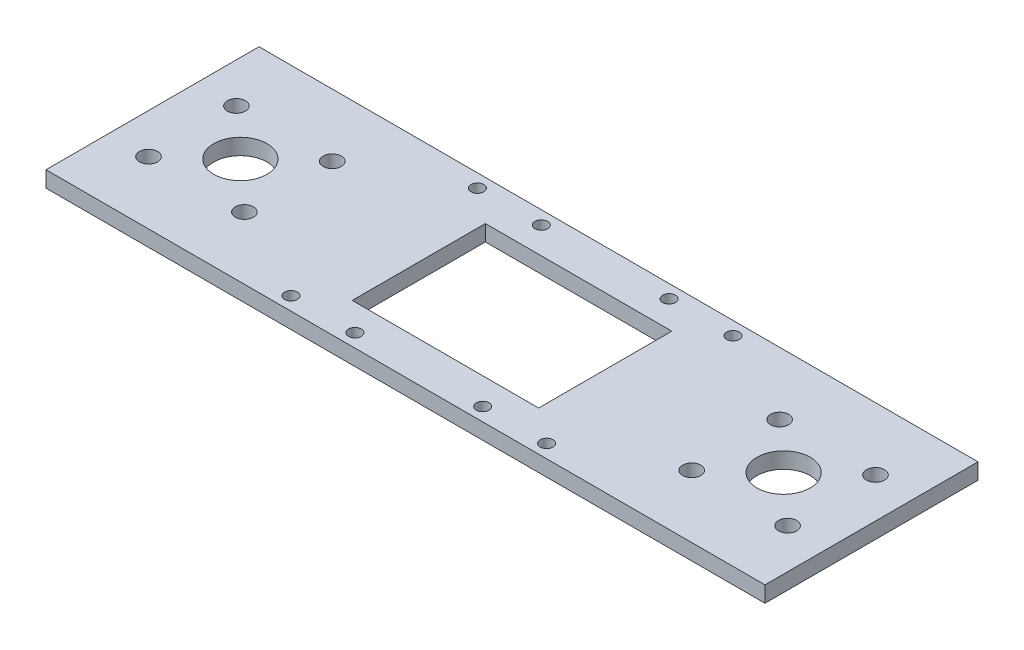
ISO-10303-21;
HEADER;
FILE_DESCRIPTION(('STEP AP214'),'2;1');
FILE_NAME('part.step','',(''),(''),'','','');
FILE_SCHEMA(('AUTOMOTIVE_DESIGN { 1 0 10303 214 1 1 1 1 }'));
ENDSEC;
DATA;
#1=APPLICATION_CONTEXT('core data for automotive mechanical design processes');
#2=APPLICATION_PROTOCOL_DEFINITION('international standard','automotive_design',2000,#1);
#3=PRODUCT_CONTEXT('',#1,'mechanical');
#4=PRODUCT('Part','Part','',(#3));
#5=PRODUCT_RELATED_PRODUCT_CATEGORY('part','',(#4));
#6=PRODUCT_DEFINITION_FORMATION('','',#4);
#7=PRODUCT_DEFINITION_CONTEXT('part definition',#1,'design');
#8=PRODUCT_DEFINITION('design','',#6,#7);
#9=PRODUCT_DEFINITION_SHAPE('','',#8);
#10=(LENGTH_UNIT() NAMED_UNIT(*) SI_UNIT(.MILLI.,.METRE.));
#11=(NAMED_UNIT(*) PLANE_ANGLE_UNIT() SI_UNIT($,.RADIAN.));
#12=(NAMED_UNIT(*) SI_UNIT($,.STERADIAN.) SOLID_ANGLE_UNIT());
#13=UNCERTAINTY_MEASURE_WITH_UNIT(LENGTH_MEASURE(1.E-05),#10,'distance_accuracy_value','');
#14=(GEOMETRIC_REPRESENTATION_CONTEXT(3) GLOBAL_UNCERTAINTY_ASSIGNED_CONTEXT((#13)) GLOBAL_UNIT_ASSIGNED_CONTEXT((#10,
#11,#12)) REPRESENTATION_CONTEXT('',''));
#15=CARTESIAN_POINT('',(0.,0.,0.));
#16=DIRECTION('',(0.,0.,1.));
#17=DIRECTION('',(1.,0.,0.));
#18=AXIS2_PLACEMENT_3D('',#15,#16,#17);
#19=CARTESIAN_POINT('',(0.,3.,0.));
#20=DIRECTION('',(0.,1.,0.));
#21=DIRECTION('',(0.,0.,1.));
#22=AXIS2_PLACEMENT_3D('',#19,#20,#21);
#23=PLANE('',#22);
#24=DIRECTION('',(0.,0.,-1.));
#25=VECTOR('',#24,1.);
#26=CARTESIAN_POINT('',(17.5,3.,-12.5));
#27=LINE('',#26,#25);
#28=CARTESIAN_POINT('',(17.5,3.,12.5));
#29=VERTEX_POINT('',#28);
#30=CARTESIAN_POINT('',(17.5,3.,-12.5));
#31=VERTEX_POINT('',#30);
#32=EDGE_CURVE('E61',#29,#31,#27,.T.);
#33=ORIENTED_EDGE('',*,*,#32,.F.);
#34=DIRECTION('',(1.,0.,0.));
#35=VECTOR('',#34,1.);
#36=CARTESIAN_POINT('',(-17.5,3.,12.5));
#37=LINE('',#36,#35);
#38=CARTESIAN_POINT('',(-17.5,3.,12.5));
#39=VERTEX_POINT('',#38);
#40=EDGE_CURVE('E132',#39,#29,#37,.T.);
#41=ORIENTED_EDGE('',*,*,#40,.F.);
#42=DIRECTION('',(0.,0.,1.));
#43=VECTOR('',#42,1.);
#44=CARTESIAN_POINT('',(-17.5,3.,-12.5));
#45=LINE('',#44,#43);
#46=CARTESIAN_POINT('',(-17.5,3.,-12.5));
#47=VERTEX_POINT('',#46);
#48=EDGE_CURVE('E136',#47,#39,#45,.T.);
#49=ORIENTED_EDGE('',*,*,#48,.F.);
#50=DIRECTION('',(-1.,0.,0.));
#51=VECTOR('',#50,1.);
#52=CARTESIAN_POINT('',(-17.5,3.,-12.5));
#53=LINE('',#52,#51);
#54=EDGE_CURVE('E145',#31,#47,#53,.T.);
#55=ORIENTED_EDGE('',*,*,#54,.F.);
#56=EDGE_LOOP('',(#33,#41,#49,#55));
#57=FACE_BOUND('',#56,.T.);
#58=CARTESIAN_POINT('',(24.,3.,-17.5000000000001));
#59=DIRECTION('',(0.,1.,0.));
#60=DIRECTION('',(0.,0.,-1.));
#61=AXIS2_PLACEMENT_3D('',#58,#59,#60);
#62=CIRCLE('',#61,1.2);
#63=CARTESIAN_POINT('',(24.,3.,-18.7000000000001));
#64=VERTEX_POINT('',#63);
#65=EDGE_CURVE('E193',#64,#64,#62,.T.);
#66=ORIENTED_EDGE('',*,*,#65,.F.);
#67=EDGE_LOOP('',(#66));
#68=FACE_BOUND('',#67,.T.);
#69=CARTESIAN_POINT('',(12.,3.,17.4999999999998));
#70=DIRECTION('',(0.,1.,0.));
#71=DIRECTION('',(0.,0.,1.));
#72=AXIS2_PLACEMENT_3D('',#69,#70,#71);
#73=CIRCLE('',#72,1.2);
#74=CARTESIAN_POINT('',(12.,3.,18.6999999999998));
#75=VERTEX_POINT('',#74);
#76=EDGE_CURVE('E209',#75,#75,#73,.T.);
#77=ORIENTED_EDGE('',*,*,#76,.F.);
#78=EDGE_LOOP('',(#77));
#79=FACE_BOUND('',#78,.T.);
#80=CARTESIAN_POINT('',(12.,3.,-17.5000000000002));
#81=DIRECTION('',(0.,1.,0.));
#82=DIRECTION('',(0.,0.,-1.));
#83=AXIS2_PLACEMENT_3D('',#80,#81,#82);
#84=CIRCLE('',#83,1.2);
#85=CARTESIAN_POINT('',(12.,3.,-18.7000000000002));
#86=VERTEX_POINT('',#85);
#87=EDGE_CURVE('E194',#86,#86,#84,.T.);
#88=ORIENTED_EDGE('',*,*,#87,.F.);
#89=EDGE_LOOP('',(#88));
#90=FACE_BOUND('',#89,.T.);
#91=CARTESIAN_POINT('',(-24.,3.,17.4999999999999));
#92=DIRECTION('',(0.,1.,0.));
#93=DIRECTION('',(0.,0.,-1.));
#94=AXIS2_PLACEMENT_3D('',#91,#92,#93);
#95=CIRCLE('',#94,1.2);
#96=CARTESIAN_POINT('',(-24.,3.,16.2999999999999));
#97=VERTEX_POINT('',#96);
#98=EDGE_CURVE('E185',#97,#97,#95,.T.);
#99=ORIENTED_EDGE('',*,*,#98,.F.);
#100=EDGE_LOOP('',(#99));
#101=FACE_BOUND('',#100,.T.);
#102=CARTESIAN_POINT('',(-24.,3.,-17.5000000000001));
#103=DIRECTION('',(0.,1.,0.));
#104=DIRECTION('',(0.,0.,1.));
#105=AXIS2_PLACEMENT_3D('',#102,#103,#104);
#106=CIRCLE('',#105,1.2);
#107=CARTESIAN_POINT('',(-24.,3.,-16.3000000000001));
#108=VERTEX_POINT('',#107);
#109=EDGE_CURVE('E177',#108,#108,#106,.T.);
#110=ORIENTED_EDGE('',*,*,#109,.F.);
#111=EDGE_LOOP('',(#110));
#112=FACE_BOUND('',#111,.T.);
#113=CARTESIAN_POINT('',(-12.,3.,17.4999999999998));
#114=DIRECTION('',(0.,1.,0.));
#115=DIRECTION('',(0.,0.,-1.));
#116=AXIS2_PLACEMENT_3D('',#113,#114,#115);
#117=CIRCLE('',#116,1.2);
#118=CARTESIAN_POINT('',(-12.,3.,16.2999999999998));
#119=VERTEX_POINT('',#118);
#120=EDGE_CURVE('E169',#119,#119,#117,.T.);
#121=ORIENTED_EDGE('',*,*,#120,.F.);
#122=EDGE_LOOP('',(#121));
#123=FACE_BOUND('',#122,.T.);
#124=CARTESIAN_POINT('',(-12.,3.,-17.5000000000002));
#125=DIRECTION('',(0.,1.,0.));
#126=DIRECTION('',(0.,0.,1.));
#127=AXIS2_PLACEMENT_3D('',#124,#125,#126);
#128=CIRCLE('',#127,1.2);
#129=CARTESIAN_POINT('',(-12.,3.,-16.3000000000002));
#130=VERTEX_POINT('',#129);
#131=EDGE_CURVE('E160',#130,#130,#128,.T.);
#132=ORIENTED_EDGE('',*,*,#131,.F.);
#133=EDGE_LOOP('',(#132));
#134=FACE_BOUND('',#133,.T.);
#135=CARTESIAN_POINT('',(24.,3.,17.4999999999999));
#136=DIRECTION('',(0.,1.,0.));
#137=DIRECTION('',(0.,0.,1.));
#138=AXIS2_PLACEMENT_3D('',#135,#136,#137);
#139=CIRCLE('',#138,1.2);
#140=CARTESIAN_POINT('',(24.,3.,18.6999999999999));
#141=VERTEX_POINT('',#140);
#142=EDGE_CURVE('E164',#141,#141,#139,.T.);
#143=ORIENTED_EDGE('',*,*,#142,.F.);
#144=EDGE_LOOP('',(#143));
#145=FACE_BOUND('',#144,.T.);
#146=CARTESIAN_POINT('',(59.9999999999999,3.,8.25000000000005));
#147=DIRECTION('',(0.,1.,0.));
#148=DIRECTION('',(0.,0.,-1.));
#149=AXIS2_PLACEMENT_3D('',#146,#147,#148);
#150=CIRCLE('',#149,1.70000000000108);
#151=CARTESIAN_POINT('',(59.9999999999999,3.,6.54999999999897));
#152=VERTEX_POINT('',#151);
#153=EDGE_CURVE('E232',#152,#152,#150,.T.);
#154=ORIENTED_EDGE('',*,*,#153,.F.);
#155=EDGE_LOOP('',(#154));
#156=FACE_BOUND('',#155,.T.);
#157=CARTESIAN_POINT('',(42.0000000000001,3.,-8.24999999999994));
#158=DIRECTION('',(0.,1.,0.));
#159=DIRECTION('',(0.,0.,-1.));
#160=AXIS2_PLACEMENT_3D('',#157,#158,#159);
#161=CIRCLE('',#160,1.70000000000108);
#162=CARTESIAN_POINT('',(42.0000000000001,3.,-9.95000000000103));
#163=VERTEX_POINT('',#162);
#164=EDGE_CURVE('E248',#163,#163,#161,.T.);
#165=ORIENTED_EDGE('',*,*,#164,.F.);
#166=EDGE_LOOP('',(#165));
#167=FACE_BOUND('',#166,.T.);
#168=CARTESIAN_POINT('',(-41.9999999999999,3.,8.25000000000007));
#169=DIRECTION('',(0.,1.,0.));
#170=DIRECTION('',(0.,0.,1.));
#171=AXIS2_PLACEMENT_3D('',#168,#169,#170);
#172=CIRCLE('',#171,1.70000000000108);
#173=CARTESIAN_POINT('',(-41.9999999999999,3.,9.95000000000115));
#174=VERTEX_POINT('',#173);
#175=EDGE_CURVE('E264',#174,#174,#172,.T.);
#176=ORIENTED_EDGE('',*,*,#175,.F.);
#177=EDGE_LOOP('',(#176));
#178=FACE_BOUND('',#177,.T.);
#179=CARTESIAN_POINT('',(51.0000000000001,3.,0.));
#180=DIRECTION('',(0.,1.,0.));
#181=DIRECTION('',(0.,0.,-1.));
#182=AXIS2_PLACEMENT_3D('',#179,#180,#181);
#183=CIRCLE('',#182,5.);
#184=CARTESIAN_POINT('',(51.0000000000001,3.,-4.99999999999994));
#185=VERTEX_POINT('',#184);
#186=EDGE_CURVE('E280',#185,#185,#183,.T.);
#187=ORIENTED_EDGE('',*,*,#186,.F.);
#188=EDGE_LOOP('',(#187));
#189=FACE_BOUND('',#188,.T.);
#190=CARTESIAN_POINT('',(-51.0000000000001,3.,0.));
#191=DIRECTION('',(0.,1.,0.));
#192=DIRECTION('',(0.,0.,1.));
#193=AXIS2_PLACEMENT_3D('',#190,#191,#192);
#194=CIRCLE('',#193,5.);
#195=CARTESIAN_POINT('',(-51.0000000000001,3.,5.00000000000006));
#196=VERTEX_POINT('',#195);
#197=EDGE_CURVE('E296',#196,#196,#194,.T.);
#198=ORIENTED_EDGE('',*,*,#197,.F.);
#199=EDGE_LOOP('',(#198));
#200=FACE_BOUND('',#199,.T.);
#201=DIRECTION('',(0.,0.,-1.));
#202=VECTOR('',#201,1.);
#203=CARTESIAN_POINT('',(67.4999999999999,3.,-19.9999999999999));
#204=LINE('',#203,#202);
#205=CARTESIAN_POINT('',(67.4999999999999,3.,20.0000000000001));
#206=VERTEX_POINT('',#205);
#207=CARTESIAN_POINT('',(67.4999999999999,3.,-19.9999999999999));
#208=VERTEX_POINT('',#207);
#209=EDGE_CURVE('E304',#206,#208,#204,.T.);
#210=ORIENTED_EDGE('',*,*,#209,.T.);
#211=DIRECTION('',(-1.,0.,0.));
#212=VECTOR('',#211,1.);
#213=CARTESIAN_POINT('',(-67.5000000000001,3.,-19.9999999999999));
#214=LINE('',#213,#212);
#215=CARTESIAN_POINT('',(-67.5000000000001,3.,-19.9999999999999));
#216=VERTEX_POINT('',#215);
#217=EDGE_CURVE('E308',#208,#216,#214,.T.);
#218=ORIENTED_EDGE('',*,*,#217,.T.);
#219=DIRECTION('',(0.,0.,1.));
#220=VECTOR('',#219,1.);
#221=CARTESIAN_POINT('',(-67.5000000000001,3.,-19.9999999999999));
#222=LINE('',#221,#220);
#223=CARTESIAN_POINT('',(-67.5000000000001,3.,20.));
#224=VERTEX_POINT('',#223);
#225=EDGE_CURVE('E312',#216,#224,#222,.T.);
#226=ORIENTED_EDGE('',*,*,#225,.T.);
#227=DIRECTION('',(1.,0.,0.));
#228=VECTOR('',#227,1.);
#229=CARTESIAN_POINT('',(-67.5000000000001,3.,20.));
#230=LINE('',#229,#228);
#231=EDGE_CURVE('E315',#224,#206,#230,.T.);
#232=ORIENTED_EDGE('',*,*,#231,.T.);
#233=EDGE_LOOP('',(#210,#218,#226,#232));
#234=FACE_BOUND('',#233,.T.);
#235=CARTESIAN_POINT('',(-60.0000000000001,3.,-8.24999999999993));
#236=DIRECTION('',(0.,1.,0.));
#237=DIRECTION('',(0.,0.,1.));
#238=AXIS2_PLACEMENT_3D('',#235,#236,#237);
#239=CIRCLE('',#238,1.70000000000108);
#240=CARTESIAN_POINT('',(-60.0000000000001,3.,-6.54999999999885));
#241=VERTEX_POINT('',#240);
#242=EDGE_CURVE('E288',#241,#241,#239,.T.);
#243=ORIENTED_EDGE('',*,*,#242,.F.);
#244=EDGE_LOOP('',(#243));
#245=FACE_BOUND('',#244,.T.);
#246=CARTESIAN_POINT('',(-42.0000000000001,3.,-8.24999999999993));
#247=DIRECTION('',(0.,1.,0.));
#248=DIRECTION('',(0.,0.,1.));
#249=AXIS2_PLACEMENT_3D('',#246,#247,#248);
#250=CIRCLE('',#249,1.70000000000108);
#251=CARTESIAN_POINT('',(-42.0000000000001,3.,-6.54999999999885));
#252=VERTEX_POINT('',#251);
#253=EDGE_CURVE('E272',#252,#252,#250,.T.);
#254=ORIENTED_EDGE('',*,*,#253,.F.);
#255=EDGE_LOOP('',(#254));
#256=FACE_BOUND('',#255,.T.);
#257=CARTESIAN_POINT('',(-59.9999999999999,3.,8.25000000000006));
#258=DIRECTION('',(0.,1.,0.));
#259=DIRECTION('',(0.,0.,1.));
#260=AXIS2_PLACEMENT_3D('',#257,#258,#259);
#261=CIRCLE('',#260,1.70000000000108);
#262=CARTESIAN_POINT('',(-59.9999999999999,3.,9.95000000000115));
#263=VERTEX_POINT('',#262);
#264=EDGE_CURVE('E256',#263,#263,#261,.T.);
#265=ORIENTED_EDGE('',*,*,#264,.F.);
#266=EDGE_LOOP('',(#265));
#267=FACE_BOUND('',#266,.T.);
#268=CARTESIAN_POINT('',(41.9999999999999,3.,8.25000000000006));
#269=DIRECTION('',(0.,1.,0.));
#270=DIRECTION('',(0.,0.,-1.));
#271=AXIS2_PLACEMENT_3D('',#268,#269,#270);
#272=CIRCLE('',#271,1.70000000000108);
#273=CARTESIAN_POINT('',(41.9999999999999,3.,6.54999999999897));
#274=VERTEX_POINT('',#273);
#275=EDGE_CURVE('E240',#274,#274,#272,.T.);
#276=ORIENTED_EDGE('',*,*,#275,.F.);
#277=EDGE_LOOP('',(#276));
#278=FACE_BOUND('',#277,.T.);
#279=CARTESIAN_POINT('',(60.0000000000001,3.,-8.24999999999995));
#280=DIRECTION('',(0.,1.,0.));
#281=DIRECTION('',(0.,0.,-1.));
#282=AXIS2_PLACEMENT_3D('',#279,#280,#281);
#283=CIRCLE('',#282,1.70000000000108);
#284=CARTESIAN_POINT('',(60.0000000000001,3.,-9.95000000000103));
#285=VERTEX_POINT('',#284);
#286=EDGE_CURVE('E224',#285,#285,#283,.T.);
#287=ORIENTED_EDGE('',*,*,#286,.F.);
#288=EDGE_LOOP('',(#287));
#289=FACE_BOUND('',#288,.T.);
#290=ADVANCED_FACE('F45',(#57,#68,#79,#90,#101,#112,#123,#134,#145,#156,#167,#178,#189,#200,
#234,#245,#256,#267,#278,#289),#23,.T.);
#291=CARTESIAN_POINT('',(0.,0.,0.));
#292=DIRECTION('',(0.,1.,0.));
#293=DIRECTION('',(0.,0.,1.));
#294=AXIS2_PLACEMENT_3D('',#291,#292,#293);
#295=PLANE('',#294);
#296=DIRECTION('',(1.,0.,0.));
#297=VECTOR('',#296,1.);
#298=CARTESIAN_POINT('',(-17.5,0.,12.5));
#299=LINE('',#298,#297);
#300=CARTESIAN_POINT('',(-17.5,0.,12.5));
#301=VERTEX_POINT('',#300);
#302=CARTESIAN_POINT('',(17.5,0.,12.5));
#303=VERTEX_POINT('',#302);
#304=EDGE_CURVE('E120',#301,#303,#299,.T.);
#305=ORIENTED_EDGE('',*,*,#304,.T.);
#306=DIRECTION('',(0.,0.,-1.));
#307=VECTOR('',#306,1.);
#308=CARTESIAN_POINT('',(17.5,0.,-12.5));
#309=LINE('',#308,#307);
#310=CARTESIAN_POINT('',(17.5,0.,-12.5));
#311=VERTEX_POINT('',#310);
#312=EDGE_CURVE('E113',#303,#311,#309,.T.);
#313=ORIENTED_EDGE('',*,*,#312,.T.);
#314=DIRECTION('',(-1.,0.,0.));
#315=VECTOR('',#314,1.);
#316=CARTESIAN_POINT('',(-17.5,0.,-12.5));
#317=LINE('',#316,#315);
#318=CARTESIAN_POINT('',(-17.5,0.,-12.5));
#319=VERTEX_POINT('',#318);
#320=EDGE_CURVE('E123',#311,#319,#317,.T.);
#321=ORIENTED_EDGE('',*,*,#320,.T.);
#322=DIRECTION('',(0.,0.,1.));
#323=VECTOR('',#322,1.);
#324=CARTESIAN_POINT('',(-17.5,0.,-12.5));
#325=LINE('',#324,#323);
#326=EDGE_CURVE('E69',#319,#301,#325,.T.);
#327=ORIENTED_EDGE('',*,*,#326,.T.);
#328=EDGE_LOOP('',(#305,#313,#321,#327));
#329=FACE_BOUND('',#328,.T.);
#330=CARTESIAN_POINT('',(24.,0.,-17.5000000000001));
#331=DIRECTION('',(0.,1.,0.));
#332=DIRECTION('',(0.,0.,-1.));
#333=AXIS2_PLACEMENT_3D('',#330,#331,#332);
#334=CIRCLE('',#333,1.2);
#335=CARTESIAN_POINT('',(24.,0.,-18.7000000000001));
#336=VERTEX_POINT('',#335);
#337=EDGE_CURVE('E205',#336,#336,#334,.T.);
#338=ORIENTED_EDGE('',*,*,#337,.T.);
#339=EDGE_LOOP('',(#338));
#340=FACE_BOUND('',#339,.T.);
#341=CARTESIAN_POINT('',(12.,0.,17.4999999999998));
#342=DIRECTION('',(0.,1.,0.));
#343=DIRECTION('',(0.,0.,1.));
#344=AXIS2_PLACEMENT_3D('',#341,#342,#343);
#345=CIRCLE('',#344,1.2);
#346=CARTESIAN_POINT('',(12.,0.,18.6999999999998));
#347=VERTEX_POINT('',#346);
#348=EDGE_CURVE('E198',#347,#347,#345,.T.);
#349=ORIENTED_EDGE('',*,*,#348,.T.);
#350=EDGE_LOOP('',(#349));
#351=FACE_BOUND('',#350,.T.);
#352=CARTESIAN_POINT('',(12.,0.,-17.5000000000002));
#353=DIRECTION('',(0.,1.,0.));
#354=DIRECTION('',(0.,0.,-1.));
#355=AXIS2_PLACEMENT_3D('',#352,#353,#354);
#356=CIRCLE('',#355,1.2);
#357=CARTESIAN_POINT('',(12.,0.,-18.7000000000002));
#358=VERTEX_POINT('',#357);
#359=EDGE_CURVE('E154',#358,#358,#356,.T.);
#360=ORIENTED_EDGE('',*,*,#359,.T.);
#361=EDGE_LOOP('',(#360));
#362=FACE_BOUND('',#361,.T.);
#363=CARTESIAN_POINT('',(-24.,0.,17.4999999999999));
#364=DIRECTION('',(0.,1.,0.));
#365=DIRECTION('',(0.,0.,-1.));
#366=AXIS2_PLACEMENT_3D('',#363,#364,#365);
#367=CIRCLE('',#366,1.2);
#368=CARTESIAN_POINT('',(-24.,0.,16.2999999999999));
#369=VERTEX_POINT('',#368);
#370=EDGE_CURVE('E189',#369,#369,#367,.T.);
#371=ORIENTED_EDGE('',*,*,#370,.T.);
#372=EDGE_LOOP('',(#371));
#373=FACE_BOUND('',#372,.T.);
#374=CARTESIAN_POINT('',(-24.,0.,-17.5000000000001));
#375=DIRECTION('',(0.,1.,0.));
#376=DIRECTION('',(0.,0.,1.));
#377=AXIS2_PLACEMENT_3D('',#374,#375,#376);
#378=CIRCLE('',#377,1.2);
#379=CARTESIAN_POINT('',(-24.,0.,-16.3000000000001));
#380=VERTEX_POINT('',#379);
#381=EDGE_CURVE('E181',#380,#380,#378,.T.);
#382=ORIENTED_EDGE('',*,*,#381,.T.);
#383=EDGE_LOOP('',(#382));
#384=FACE_BOUND('',#383,.T.);
#385=CARTESIAN_POINT('',(-12.,0.,17.4999999999998));
#386=DIRECTION('',(0.,1.,0.));
#387=DIRECTION('',(0.,0.,-1.));
#388=AXIS2_PLACEMENT_3D('',#385,#386,#387);
#389=CIRCLE('',#388,1.2);
#390=CARTESIAN_POINT('',(-12.,0.,16.2999999999998));
#391=VERTEX_POINT('',#390);
#392=EDGE_CURVE('E173',#391,#391,#389,.T.);
#393=ORIENTED_EDGE('',*,*,#392,.T.);
#394=EDGE_LOOP('',(#393));
#395=FACE_BOUND('',#394,.T.);
#396=CARTESIAN_POINT('',(-12.,0.,-17.5000000000002));
#397=DIRECTION('',(0.,1.,0.));
#398=DIRECTION('',(0.,0.,1.));
#399=AXIS2_PLACEMENT_3D('',#396,#397,#398);
#400=CIRCLE('',#399,1.2);
#401=CARTESIAN_POINT('',(-12.,0.,-16.3000000000002));
#402=VERTEX_POINT('',#401);
#403=EDGE_CURVE('E165',#402,#402,#400,.T.);
#404=ORIENTED_EDGE('',*,*,#403,.T.);
#405=EDGE_LOOP('',(#404));
#406=FACE_BOUND('',#405,.T.);
#407=CARTESIAN_POINT('',(24.,0.,17.4999999999999));
#408=DIRECTION('',(0.,1.,0.));
#409=DIRECTION('',(0.,0.,1.));
#410=AXIS2_PLACEMENT_3D('',#407,#408,#409);
#411=CIRCLE('',#410,1.2);
#412=CARTESIAN_POINT('',(24.,0.,18.6999999999999));
#413=VERTEX_POINT('',#412);
#414=EDGE_CURVE('E216',#413,#413,#411,.T.);
#415=ORIENTED_EDGE('',*,*,#414,.T.);
#416=EDGE_LOOP('',(#415));
#417=FACE_BOUND('',#416,.T.);
#418=CARTESIAN_POINT('',(60.0000000000001,0.,-8.24999999999995));
#419=DIRECTION('',(0.,1.,0.));
#420=DIRECTION('',(0.,0.,-1.));
#421=AXIS2_PLACEMENT_3D('',#418,#419,#420);
#422=CIRCLE('',#421,1.70000000000108);
#423=CARTESIAN_POINT('',(60.0000000000001,0.,-9.95000000000103));
#424=VERTEX_POINT('',#423);
#425=EDGE_CURVE('E220',#424,#424,#422,.T.);
#426=ORIENTED_EDGE('',*,*,#425,.T.);
#427=EDGE_LOOP('',(#426));
#428=FACE_BOUND('',#427,.T.);
#429=CARTESIAN_POINT('',(59.9999999999999,0.,8.25000000000005));
#430=DIRECTION('',(0.,1.,0.));
#431=DIRECTION('',(0.,0.,-1.));
#432=AXIS2_PLACEMENT_3D('',#429,#430,#431);
#433=CIRCLE('',#432,1.70000000000108);
#434=CARTESIAN_POINT('',(59.9999999999999,0.,6.54999999999897));
#435=VERTEX_POINT('',#434);
#436=EDGE_CURVE('E228',#435,#435,#433,.T.);
#437=ORIENTED_EDGE('',*,*,#436,.T.);
#438=EDGE_LOOP('',(#437));
#439=FACE_BOUND('',#438,.T.);
#440=CARTESIAN_POINT('',(41.9999999999999,0.,8.25000000000006));
#441=DIRECTION('',(0.,1.,0.));
#442=DIRECTION('',(0.,0.,-1.));
#443=AXIS2_PLACEMENT_3D('',#440,#441,#442);
#444=CIRCLE('',#443,1.70000000000108);
#445=CARTESIAN_POINT('',(41.9999999999999,0.,6.54999999999897));
#446=VERTEX_POINT('',#445);
#447=EDGE_CURVE('E236',#446,#446,#444,.T.);
#448=ORIENTED_EDGE('',*,*,#447,.T.);
#449=EDGE_LOOP('',(#448));
#450=FACE_BOUND('',#449,.T.);
#451=CARTESIAN_POINT('',(42.0000000000001,0.,-8.24999999999994));
#452=DIRECTION('',(0.,1.,0.));
#453=DIRECTION('',(0.,0.,-1.));
#454=AXIS2_PLACEMENT_3D('',#451,#452,#453);
#455=CIRCLE('',#454,1.70000000000108);
#456=CARTESIAN_POINT('',(42.0000000000001,0.,-9.95000000000103));
#457=VERTEX_POINT('',#456);
#458=EDGE_CURVE('E244',#457,#457,#455,.T.);
#459=ORIENTED_EDGE('',*,*,#458,.T.);
#460=EDGE_LOOP('',(#459));
#461=FACE_BOUND('',#460,.T.);
#462=CARTESIAN_POINT('',(-59.9999999999999,0.,8.25000000000006));
#463=DIRECTION('',(0.,1.,0.));
#464=DIRECTION('',(0.,0.,1.));
#465=AXIS2_PLACEMENT_3D('',#462,#463,#464);
#466=CIRCLE('',#465,1.70000000000108);
#467=CARTESIAN_POINT('',(-59.9999999999999,0.,9.95000000000115));
#468=VERTEX_POINT('',#467);
#469=EDGE_CURVE('E252',#468,#468,#466,.T.);
#470=ORIENTED_EDGE('',*,*,#469,.T.);
#471=EDGE_LOOP('',(#470));
#472=FACE_BOUND('',#471,.T.);
#473=CARTESIAN_POINT('',(-41.9999999999999,0.,8.25000000000007));
#474=DIRECTION('',(0.,1.,0.));
#475=DIRECTION('',(0.,0.,1.));
#476=AXIS2_PLACEMENT_3D('',#473,#474,#475);
#477=CIRCLE('',#476,1.70000000000108);
#478=CARTESIAN_POINT('',(-41.9999999999999,0.,9.95000000000115));
#479=VERTEX_POINT('',#478);
#480=EDGE_CURVE('E260',#479,#479,#477,.T.);
#481=ORIENTED_EDGE('',*,*,#480,.T.);
#482=EDGE_LOOP('',(#481));
#483=FACE_BOUND('',#482,.T.);
#484=CARTESIAN_POINT('',(-42.0000000000001,0.,-8.24999999999993));
#485=DIRECTION('',(0.,1.,0.));
#486=DIRECTION('',(0.,0.,1.));
#487=AXIS2_PLACEMENT_3D('',#484,#485,#486);
#488=CIRCLE('',#487,1.70000000000108);
#489=CARTESIAN_POINT('',(-42.0000000000001,0.,-6.54999999999885));
#490=VERTEX_POINT('',#489);
#491=EDGE_CURVE('E268',#490,#490,#488,.T.);
#492=ORIENTED_EDGE('',*,*,#491,.T.);
#493=EDGE_LOOP('',(#492));
#494=FACE_BOUND('',#493,.T.);
#495=CARTESIAN_POINT('',(51.0000000000001,0.,0.));
#496=DIRECTION('',(0.,1.,0.));
#497=DIRECTION('',(0.,0.,-1.));
#498=AXIS2_PLACEMENT_3D('',#495,#496,#497);
#499=CIRCLE('',#498,5.);
#500=CARTESIAN_POINT('',(51.0000000000001,0.,-4.99999999999994));
#501=VERTEX_POINT('',#500);
#502=EDGE_CURVE('E276',#501,#501,#499,.T.);
#503=ORIENTED_EDGE('',*,*,#502,.T.);
#504=EDGE_LOOP('',(#503));
#505=FACE_BOUND('',#504,.T.);
#506=CARTESIAN_POINT('',(-60.0000000000001,0.,-8.24999999999993));
#507=DIRECTION('',(0.,1.,0.));
#508=DIRECTION('',(0.,0.,1.));
#509=AXIS2_PLACEMENT_3D('',#506,#507,#508);
#510=CIRCLE('',#509,1.70000000000108);
#511=CARTESIAN_POINT('',(-60.0000000000001,0.,-6.54999999999885));
#512=VERTEX_POINT('',#511);
#513=EDGE_CURVE('E284',#512,#512,#510,.T.);
#514=ORIENTED_EDGE('',*,*,#513,.T.);
#515=EDGE_LOOP('',(#514));
#516=FACE_BOUND('',#515,.T.);
#517=CARTESIAN_POINT('',(-51.0000000000001,0.,0.));
#518=DIRECTION('',(0.,1.,0.));
#519=DIRECTION('',(0.,0.,1.));
#520=AXIS2_PLACEMENT_3D('',#517,#518,#519);
#521=CIRCLE('',#520,5.);
#522=CARTESIAN_POINT('',(-51.0000000000001,0.,5.00000000000006));
#523=VERTEX_POINT('',#522);
#524=EDGE_CURVE('E292',#523,#523,#521,.T.);
#525=ORIENTED_EDGE('',*,*,#524,.T.);
#526=EDGE_LOOP('',(#525));
#527=FACE_BOUND('',#526,.T.);
#528=DIRECTION('',(0.,0.,-1.));
#529=VECTOR('',#528,1.);
#530=CARTESIAN_POINT('',(67.4999999999999,0.,-19.9999999999999));
#531=LINE('',#530,#529);
#532=CARTESIAN_POINT('',(67.4999999999999,0.,20.0000000000001));
#533=VERTEX_POINT('',#532);
#534=CARTESIAN_POINT('',(67.4999999999999,0.,-19.9999999999999));
#535=VERTEX_POINT('',#534);
#536=EDGE_CURVE('E300',#533,#535,#531,.T.);
#537=ORIENTED_EDGE('',*,*,#536,.F.);
#538=DIRECTION('',(1.,0.,0.));
#539=VECTOR('',#538,1.);
#540=CARTESIAN_POINT('',(-67.5000000000001,0.,20.));
#541=LINE('',#540,#539);
#542=CARTESIAN_POINT('',(-67.5000000000001,0.,20.));
#543=VERTEX_POINT('',#542);
#544=EDGE_CURVE('E309',#543,#533,#541,.T.);
#545=ORIENTED_EDGE('',*,*,#544,.F.);
#546=DIRECTION('',(0.,0.,1.));
#547=VECTOR('',#546,1.);
#548=CARTESIAN_POINT('',(-67.5000000000001,0.,-19.9999999999999));
#549=LINE('',#548,#547);
#550=CARTESIAN_POINT('',(-67.5000000000001,0.,-19.9999999999999));
#551=VERTEX_POINT('',#550);
#552=EDGE_CURVE('E325',#551,#543,#549,.T.);
#553=ORIENTED_EDGE('',*,*,#552,.F.);
#554=DIRECTION('',(-1.,0.,0.));
#555=VECTOR('',#554,1.);
#556=CARTESIAN_POINT('',(-67.5000000000001,0.,-19.9999999999999));
#557=LINE('',#556,#555);
#558=EDGE_CURVE('E322',#535,#551,#557,.T.);
#559=ORIENTED_EDGE('',*,*,#558,.F.);
#560=EDGE_LOOP('',(#537,#545,#553,#559));
#561=FACE_BOUND('',#560,.T.);
#562=ADVANCED_FACE('F128',(#329,#340,#351,#362,#373,#384,#395,#406,#417,#428,#439,#450,#461,
#472,#483,#494,#505,#516,#527,#561),#295,.F.);
#563=CARTESIAN_POINT('',(67.4999999999999,3.,-19.9999999999999));
#564=DIRECTION('',(-1.,0.,0.));
#565=DIRECTION('',(0.,0.,1.));
#566=AXIS2_PLACEMENT_3D('',#563,#564,#565);
#567=PLANE('',#566);
#568=ORIENTED_EDGE('',*,*,#536,.T.);
#569=DIRECTION('',(0.,-1.,0.));
#570=VECTOR('',#569,1.);
#571=CARTESIAN_POINT('',(67.4999999999999,3.,-19.9999999999999));
#572=LINE('',#571,#570);
#573=EDGE_CURVE('E11',#208,#535,#572,.T.);
#574=ORIENTED_EDGE('',*,*,#573,.F.);
#575=ORIENTED_EDGE('',*,*,#209,.F.);
#576=DIRECTION('',(0.,-1.,0.));
#577=VECTOR('',#576,1.);
#578=CARTESIAN_POINT('',(67.4999999999999,3.,20.0000000000001));
#579=LINE('',#578,#577);
#580=EDGE_CURVE('E318',#206,#533,#579,.T.);
#581=ORIENTED_EDGE('',*,*,#580,.T.);
#582=EDGE_LOOP('',(#568,#574,#575,#581));
#583=FACE_BOUND('',#582,.T.);
#584=ADVANCED_FACE('F47',(#583),#567,.F.);
#585=CARTESIAN_POINT('',(-67.5000000000001,3.,-19.9999999999999));
#586=DIRECTION('',(0.,0.,1.));
#587=DIRECTION('',(1.,0.,0.));
#588=AXIS2_PLACEMENT_3D('',#585,#586,#587);
#589=PLANE('',#588);
#590=ORIENTED_EDGE('',*,*,#558,.T.);
#591=DIRECTION('',(0.,-1.,0.));
#592=VECTOR('',#591,1.);
#593=CARTESIAN_POINT('',(-67.5000000000001,3.,-19.9999999999999));
#594=LINE('',#593,#592);
#595=EDGE_CURVE('E54',#216,#551,#594,.T.);
#596=ORIENTED_EDGE('',*,*,#595,.F.);
#597=ORIENTED_EDGE('',*,*,#217,.F.);
#598=ORIENTED_EDGE('',*,*,#573,.T.);
#599=EDGE_LOOP('',(#590,#596,#597,#598));
#600=FACE_BOUND('',#599,.T.);
#601=ADVANCED_FACE('F357',(#600),#589,.F.);
#602=CARTESIAN_POINT('',(-67.5000000000001,3.,-19.9999999999999));
#603=DIRECTION('',(1.,0.,0.));
#604=DIRECTION('',(0.,0.,-1.));
#605=AXIS2_PLACEMENT_3D('',#602,#603,#604);
#606=PLANE('',#605);
#607=ORIENTED_EDGE('',*,*,#552,.T.);
#608=DIRECTION('',(0.,-1.,0.));
#609=VECTOR('',#608,1.);
#610=CARTESIAN_POINT('',(-67.5000000000001,3.,20.));
#611=LINE('',#610,#609);
#612=EDGE_CURVE('E333',#224,#543,#611,.T.);
#613=ORIENTED_EDGE('',*,*,#612,.F.);
#614=ORIENTED_EDGE('',*,*,#225,.F.);
#615=ORIENTED_EDGE('',*,*,#595,.T.);
#616=EDGE_LOOP('',(#607,#613,#614,#615));
#617=FACE_BOUND('',#616,.T.);
#618=ADVANCED_FACE('F342',(#617),#606,.F.);
#619=CARTESIAN_POINT('',(-67.5000000000001,3.,20.));
#620=DIRECTION('',(0.,0.,-1.));
#621=DIRECTION('',(-1.,0.,0.));
#622=AXIS2_PLACEMENT_3D('',#619,#620,#621);
#623=PLANE('',#622);
#624=ORIENTED_EDGE('',*,*,#544,.T.);
#625=ORIENTED_EDGE('',*,*,#580,.F.);
#626=ORIENTED_EDGE('',*,*,#231,.F.);
#627=ORIENTED_EDGE('',*,*,#612,.T.);
#628=EDGE_LOOP('',(#624,#625,#626,#627));
#629=FACE_BOUND('',#628,.T.);
#630=ADVANCED_FACE('F350',(#629),#623,.F.);
#631=CARTESIAN_POINT('',(-51.0000000000001,3.,0.));
#632=DIRECTION('',(0.,-1.,0.));
#633=DIRECTION('',(0.,0.,-1.));
#634=AXIS2_PLACEMENT_3D('',#631,#632,#633);
#635=CYLINDRICAL_SURFACE('',#634,5.);
#636=ORIENTED_EDGE('',*,*,#197,.T.);
#637=EDGE_LOOP('',(#636));
#638=FACE_BOUND('',#637,.T.);
#639=ORIENTED_EDGE('',*,*,#524,.F.);
#640=EDGE_LOOP('',(#639));
#641=FACE_BOUND('',#640,.T.);
#642=ADVANCED_FACE('F374',(#638,#641),#635,.F.);
#643=CARTESIAN_POINT('',(-60.0000000000001,3.,-8.24999999999993));
#644=DIRECTION('',(0.,-1.,0.));
#645=DIRECTION('',(0.,0.,-1.));
#646=AXIS2_PLACEMENT_3D('',#643,#644,#645);
#647=CYLINDRICAL_SURFACE('',#646,1.70000000000108);
#648=ORIENTED_EDGE('',*,*,#242,.T.);
#649=EDGE_LOOP('',(#648));
#650=FACE_BOUND('',#649,.T.);
#651=ORIENTED_EDGE('',*,*,#513,.F.);
#652=EDGE_LOOP('',(#651));
#653=FACE_BOUND('',#652,.T.);
#654=ADVANCED_FACE('F381',(#650,#653),#647,.F.);
#655=CARTESIAN_POINT('',(51.0000000000001,3.,0.));
#656=DIRECTION('',(0.,-1.,0.));
#657=DIRECTION('',(0.,0.,-1.));
#658=AXIS2_PLACEMENT_3D('',#655,#656,#657);
#659=CYLINDRICAL_SURFACE('',#658,5.);
#660=ORIENTED_EDGE('',*,*,#186,.T.);
#661=EDGE_LOOP('',(#660));
#662=FACE_BOUND('',#661,.T.);
#663=ORIENTED_EDGE('',*,*,#502,.F.);
#664=EDGE_LOOP('',(#663));
#665=FACE_BOUND('',#664,.T.);
#666=ADVANCED_FACE('F386',(#662,#665),#659,.F.);
#667=CARTESIAN_POINT('',(-42.0000000000001,3.,-8.24999999999993));
#668=DIRECTION('',(0.,-1.,0.));
#669=DIRECTION('',(0.,0.,-1.));
#670=AXIS2_PLACEMENT_3D('',#667,#668,#669);
#671=CYLINDRICAL_SURFACE('',#670,1.70000000000108);
#672=ORIENTED_EDGE('',*,*,#253,.T.);
#673=EDGE_LOOP('',(#672));
#674=FACE_BOUND('',#673,.T.);
#675=ORIENTED_EDGE('',*,*,#491,.F.);
#676=EDGE_LOOP('',(#675));
#677=FACE_BOUND('',#676,.T.);
#678=ADVANCED_FACE('F396',(#674,#677),#671,.F.);
#679=CARTESIAN_POINT('',(-41.9999999999999,3.,8.25000000000007));
#680=DIRECTION('',(0.,-1.,0.));
#681=DIRECTION('',(0.,0.,-1.));
#682=AXIS2_PLACEMENT_3D('',#679,#680,#681);
#683=CYLINDRICAL_SURFACE('',#682,1.70000000000108);
#684=ORIENTED_EDGE('',*,*,#175,.T.);
#685=EDGE_LOOP('',(#684));
#686=FACE_BOUND('',#685,.T.);
#687=ORIENTED_EDGE('',*,*,#480,.F.);
#688=EDGE_LOOP('',(#687));
#689=FACE_BOUND('',#688,.T.);
#690=ADVANCED_FACE('F403',(#686,#689),#683,.F.);
#691=CARTESIAN_POINT('',(-59.9999999999999,3.,8.25000000000006));
#692=DIRECTION('',(0.,-1.,0.));
#693=DIRECTION('',(0.,0.,-1.));
#694=AXIS2_PLACEMENT_3D('',#691,#692,#693);
#695=CYLINDRICAL_SURFACE('',#694,1.70000000000108);
#696=ORIENTED_EDGE('',*,*,#264,.T.);
#697=EDGE_LOOP('',(#696));
#698=FACE_BOUND('',#697,.T.);
#699=ORIENTED_EDGE('',*,*,#469,.F.);
#700=EDGE_LOOP('',(#699));
#701=FACE_BOUND('',#700,.T.);
#702=ADVANCED_FACE('F407',(#698,#701),#695,.F.);
#703=CARTESIAN_POINT('',(42.0000000000001,3.,-8.24999999999994));
#704=DIRECTION('',(0.,-1.,0.));
#705=DIRECTION('',(0.,0.,-1.));
#706=AXIS2_PLACEMENT_3D('',#703,#704,#705);
#707=CYLINDRICAL_SURFACE('',#706,1.70000000000108);
#708=ORIENTED_EDGE('',*,*,#164,.T.);
#709=EDGE_LOOP('',(#708));
#710=FACE_BOUND('',#709,.T.);
#711=ORIENTED_EDGE('',*,*,#458,.F.);
#712=EDGE_LOOP('',(#711));
#713=FACE_BOUND('',#712,.T.);
#714=ADVANCED_FACE('F411',(#710,#713),#707,.F.);
#715=CARTESIAN_POINT('',(41.9999999999999,3.,8.25000000000006));
#716=DIRECTION('',(0.,-1.,0.));
#717=DIRECTION('',(0.,0.,-1.));
#718=AXIS2_PLACEMENT_3D('',#715,#716,#717);
#719=CYLINDRICAL_SURFACE('',#718,1.70000000000108);
#720=ORIENTED_EDGE('',*,*,#275,.T.);
#721=EDGE_LOOP('',(#720));
#722=FACE_BOUND('',#721,.T.);
#723=ORIENTED_EDGE('',*,*,#447,.F.);
#724=EDGE_LOOP('',(#723));
#725=FACE_BOUND('',#724,.T.);
#726=ADVANCED_FACE('F415',(#722,#725),#719,.F.);
#727=CARTESIAN_POINT('',(59.9999999999999,3.,8.25000000000005));
#728=DIRECTION('',(0.,-1.,0.));
#729=DIRECTION('',(0.,0.,-1.));
#730=AXIS2_PLACEMENT_3D('',#727,#728,#729);
#731=CYLINDRICAL_SURFACE('',#730,1.70000000000108);
#732=ORIENTED_EDGE('',*,*,#153,.T.);
#733=EDGE_LOOP('',(#732));
#734=FACE_BOUND('',#733,.T.);
#735=ORIENTED_EDGE('',*,*,#436,.F.);
#736=EDGE_LOOP('',(#735));
#737=FACE_BOUND('',#736,.T.);
#738=ADVANCED_FACE('F419',(#734,#737),#731,.F.);
#739=CARTESIAN_POINT('',(60.0000000000001,3.,-8.24999999999995));
#740=DIRECTION('',(0.,-1.,0.));
#741=DIRECTION('',(0.,0.,-1.));
#742=AXIS2_PLACEMENT_3D('',#739,#740,#741);
#743=CYLINDRICAL_SURFACE('',#742,1.70000000000108);
#744=ORIENTED_EDGE('',*,*,#286,.T.);
#745=EDGE_LOOP('',(#744));
#746=FACE_BOUND('',#745,.T.);
#747=ORIENTED_EDGE('',*,*,#425,.F.);
#748=EDGE_LOOP('',(#747));
#749=FACE_BOUND('',#748,.T.);
#750=ADVANCED_FACE('F423',(#746,#749),#743,.F.);
#751=CARTESIAN_POINT('',(24.,0.,17.4999999999999));
#752=DIRECTION('',(0.,1.,0.));
#753=DIRECTION('',(0.,0.,1.));
#754=AXIS2_PLACEMENT_3D('',#751,#752,#753);
#755=CYLINDRICAL_SURFACE('',#754,1.2);
#756=ORIENTED_EDGE('',*,*,#414,.F.);
#757=EDGE_LOOP('',(#756));
#758=FACE_BOUND('',#757,.T.);
#759=ORIENTED_EDGE('',*,*,#142,.T.);
#760=EDGE_LOOP('',(#759));
#761=FACE_BOUND('',#760,.T.);
#762=ADVANCED_FACE('F427',(#758,#761),#755,.F.);
#763=CARTESIAN_POINT('',(-12.,0.,-17.5000000000002));
#764=DIRECTION('',(0.,1.,0.));
#765=DIRECTION('',(0.,0.,1.));
#766=AXIS2_PLACEMENT_3D('',#763,#764,#765);
#767=CYLINDRICAL_SURFACE('',#766,1.2);
#768=ORIENTED_EDGE('',*,*,#403,.F.);
#769=EDGE_LOOP('',(#768));
#770=FACE_BOUND('',#769,.T.);
#771=ORIENTED_EDGE('',*,*,#131,.T.);
#772=EDGE_LOOP('',(#771));
#773=FACE_BOUND('',#772,.T.);
#774=ADVANCED_FACE('F431',(#770,#773),#767,.F.);
#775=CARTESIAN_POINT('',(-12.,0.,17.4999999999998));
#776=DIRECTION('',(0.,1.,0.));
#777=DIRECTION('',(0.,0.,1.));
#778=AXIS2_PLACEMENT_3D('',#775,#776,#777);
#779=CYLINDRICAL_SURFACE('',#778,1.2);
#780=ORIENTED_EDGE('',*,*,#392,.F.);
#781=EDGE_LOOP('',(#780));
#782=FACE_BOUND('',#781,.T.);
#783=ORIENTED_EDGE('',*,*,#120,.T.);
#784=EDGE_LOOP('',(#783));
#785=FACE_BOUND('',#784,.T.);
#786=ADVANCED_FACE('F451',(#782,#785),#779,.F.);
#787=CARTESIAN_POINT('',(-24.,0.,-17.5000000000001));
#788=DIRECTION('',(0.,1.,0.));
#789=DIRECTION('',(0.,0.,1.));
#790=AXIS2_PLACEMENT_3D('',#787,#788,#789);
#791=CYLINDRICAL_SURFACE('',#790,1.2);
#792=ORIENTED_EDGE('',*,*,#381,.F.);
#793=EDGE_LOOP('',(#792));
#794=FACE_BOUND('',#793,.T.);
#795=ORIENTED_EDGE('',*,*,#109,.T.);
#796=EDGE_LOOP('',(#795));
#797=FACE_BOUND('',#796,.T.);
#798=ADVANCED_FACE('F447',(#794,#797),#791,.F.);
#799=CARTESIAN_POINT('',(-24.,0.,17.4999999999999));
#800=DIRECTION('',(0.,1.,0.));
#801=DIRECTION('',(0.,0.,1.));
#802=AXIS2_PLACEMENT_3D('',#799,#800,#801);
#803=CYLINDRICAL_SURFACE('',#802,1.2);
#804=ORIENTED_EDGE('',*,*,#370,.F.);
#805=EDGE_LOOP('',(#804));
#806=FACE_BOUND('',#805,.T.);
#807=ORIENTED_EDGE('',*,*,#98,.T.);
#808=EDGE_LOOP('',(#807));
#809=FACE_BOUND('',#808,.T.);
#810=ADVANCED_FACE('F443',(#806,#809),#803,.F.);
#811=CARTESIAN_POINT('',(12.,0.,-17.5000000000002));
#812=DIRECTION('',(0.,1.,0.));
#813=DIRECTION('',(0.,0.,1.));
#814=AXIS2_PLACEMENT_3D('',#811,#812,#813);
#815=CYLINDRICAL_SURFACE('',#814,1.2);
#816=ORIENTED_EDGE('',*,*,#359,.F.);
#817=EDGE_LOOP('',(#816));
#818=FACE_BOUND('',#817,.T.);
#819=ORIENTED_EDGE('',*,*,#87,.T.);
#820=EDGE_LOOP('',(#819));
#821=FACE_BOUND('',#820,.T.);
#822=ADVANCED_FACE('F437',(#818,#821),#815,.F.);
#823=CARTESIAN_POINT('',(12.,0.,17.4999999999998));
#824=DIRECTION('',(0.,1.,0.));
#825=DIRECTION('',(0.,0.,1.));
#826=AXIS2_PLACEMENT_3D('',#823,#824,#825);
#827=CYLINDRICAL_SURFACE('',#826,1.2);
#828=ORIENTED_EDGE('',*,*,#348,.F.);
#829=EDGE_LOOP('',(#828));
#830=FACE_BOUND('',#829,.T.);
#831=ORIENTED_EDGE('',*,*,#76,.T.);
#832=EDGE_LOOP('',(#831));
#833=FACE_BOUND('',#832,.T.);
#834=ADVANCED_FACE('F433',(#830,#833),#827,.F.);
#835=CARTESIAN_POINT('',(24.,0.,-17.5000000000001));
#836=DIRECTION('',(0.,1.,0.));
#837=DIRECTION('',(0.,0.,1.));
#838=AXIS2_PLACEMENT_3D('',#835,#836,#837);
#839=CYLINDRICAL_SURFACE('',#838,1.2);
#840=ORIENTED_EDGE('',*,*,#337,.F.);
#841=EDGE_LOOP('',(#840));
#842=FACE_BOUND('',#841,.T.);
#843=ORIENTED_EDGE('',*,*,#65,.T.);
#844=EDGE_LOOP('',(#843));
#845=FACE_BOUND('',#844,.T.);
#846=ADVANCED_FACE('F436',(#842,#845),#839,.F.);
#847=CARTESIAN_POINT('',(17.5,0.,-12.5));
#848=DIRECTION('',(1.,0.,0.));
#849=DIRECTION('',(0.,0.,-1.));
#850=AXIS2_PLACEMENT_3D('',#847,#848,#849);
#851=PLANE('',#850);
#852=ORIENTED_EDGE('',*,*,#32,.T.);
#853=DIRECTION('',(0.,1.,0.));
#854=VECTOR('',#853,1.);
#855=CARTESIAN_POINT('',(17.5,0.,-12.5));
#856=LINE('',#855,#854);
#857=EDGE_CURVE('E109',#311,#31,#856,.T.);
#858=ORIENTED_EDGE('',*,*,#857,.F.);
#859=ORIENTED_EDGE('',*,*,#312,.F.);
#860=DIRECTION('',(0.,1.,0.));
#861=VECTOR('',#860,1.);
#862=CARTESIAN_POINT('',(17.5,0.,12.5));
#863=LINE('',#862,#861);
#864=EDGE_CURVE('E151',#303,#29,#863,.T.);
#865=ORIENTED_EDGE('',*,*,#864,.T.);
#866=EDGE_LOOP('',(#852,#858,#859,#865));
#867=FACE_BOUND('',#866,.T.);
#868=ADVANCED_FACE('F111',(#867),#851,.F.);
#869=CARTESIAN_POINT('',(-17.5,0.,12.5));
#870=DIRECTION('',(0.,0.,1.));
#871=DIRECTION('',(1.,0.,0.));
#872=AXIS2_PLACEMENT_3D('',#869,#870,#871);
#873=PLANE('',#872);
#874=ORIENTED_EDGE('',*,*,#40,.T.);
#875=ORIENTED_EDGE('',*,*,#864,.F.);
#876=ORIENTED_EDGE('',*,*,#304,.F.);
#877=DIRECTION('',(0.,1.,0.));
#878=VECTOR('',#877,1.);
#879=CARTESIAN_POINT('',(-17.5,0.,12.5));
#880=LINE('',#879,#878);
#881=EDGE_CURVE('E155',#301,#39,#880,.T.);
#882=ORIENTED_EDGE('',*,*,#881,.T.);
#883=EDGE_LOOP('',(#874,#875,#876,#882));
#884=FACE_BOUND('',#883,.T.);
#885=ADVANCED_FACE('F461',(#884),#873,.F.);
#886=CARTESIAN_POINT('',(-17.5,0.,-12.5));
#887=DIRECTION('',(-1.,0.,0.));
#888=DIRECTION('',(0.,0.,1.));
#889=AXIS2_PLACEMENT_3D('',#886,#887,#888);
#890=PLANE('',#889);
#891=ORIENTED_EDGE('',*,*,#48,.T.);
#892=ORIENTED_EDGE('',*,*,#881,.F.);
#893=ORIENTED_EDGE('',*,*,#326,.F.);
#894=DIRECTION('',(0.,1.,0.));
#895=VECTOR('',#894,1.);
#896=CARTESIAN_POINT('',(-17.5,0.,-12.5));
#897=LINE('',#896,#895);
#898=EDGE_CURVE('E119',#319,#47,#897,.T.);
#899=ORIENTED_EDGE('',*,*,#898,.T.);
#900=EDGE_LOOP('',(#891,#892,#893,#899));
#901=FACE_BOUND('',#900,.T.);
#902=ADVANCED_FACE('F464',(#901),#890,.F.);
#903=CARTESIAN_POINT('',(-17.5,0.,-12.5));
#904=DIRECTION('',(0.,0.,-1.));
#905=DIRECTION('',(-1.,0.,0.));
#906=AXIS2_PLACEMENT_3D('',#903,#904,#905);
#907=PLANE('',#906);
#908=ORIENTED_EDGE('',*,*,#54,.T.);
#909=ORIENTED_EDGE('',*,*,#898,.F.);
#910=ORIENTED_EDGE('',*,*,#320,.F.);
#911=ORIENTED_EDGE('',*,*,#857,.T.);
#912=EDGE_LOOP('',(#908,#909,#910,#911));
#913=FACE_BOUND('',#912,.T.);
#914=ADVANCED_FACE('F124',(#913),#907,.F.);
#915=CLOSED_SHELL('',(#290,#562,#584,#601,#618,#630,#642,#654,#666,#678,#690,#702,#714,#726,
#738,#750,#762,#774,#786,#798,#810,#822,#834,#846,#868,#885,#902,#914));
#916=MANIFOLD_SOLID_BREP('B2',#915);
#917=ADVANCED_BREP_SHAPE_REPRESENTATION('',(#18,#916),#14);
#918=SHAPE_DEFINITION_REPRESENTATION(#9,#917);
ENDSEC;
END-ISO-10303-21;
